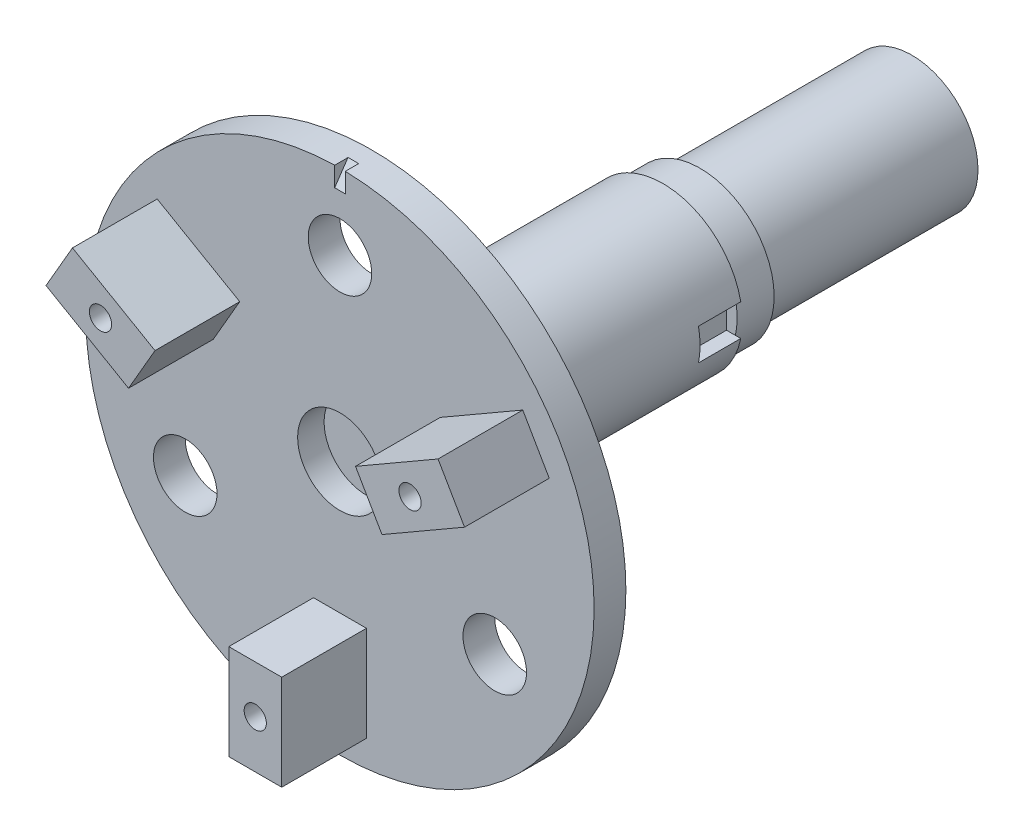
ISO-10303-21;
HEADER;
FILE_DESCRIPTION(('STEP AP214'),'2;1');
FILE_NAME('part.step','',(''),(''),'','','');
FILE_SCHEMA(('AUTOMOTIVE_DESIGN { 1 0 10303 214 1 1 1 1 }'));
ENDSEC;
DATA;
#1=APPLICATION_CONTEXT('core data for automotive mechanical design processes');
#2=APPLICATION_PROTOCOL_DEFINITION('international standard','automotive_design',2000,#1);
#3=PRODUCT_CONTEXT('',#1,'mechanical');
#4=PRODUCT('Part','Part','',(#3));
#5=PRODUCT_RELATED_PRODUCT_CATEGORY('part','',(#4));
#6=PRODUCT_DEFINITION_FORMATION('','',#4);
#7=PRODUCT_DEFINITION_CONTEXT('part definition',#1,'design');
#8=PRODUCT_DEFINITION('design','',#6,#7);
#9=PRODUCT_DEFINITION_SHAPE('','',#8);
#10=(LENGTH_UNIT() NAMED_UNIT(*) SI_UNIT(.MILLI.,.METRE.));
#11=(NAMED_UNIT(*) PLANE_ANGLE_UNIT() SI_UNIT($,.RADIAN.));
#12=(NAMED_UNIT(*) SI_UNIT($,.STERADIAN.) SOLID_ANGLE_UNIT());
#13=UNCERTAINTY_MEASURE_WITH_UNIT(LENGTH_MEASURE(1.E-05),#10,'distance_accuracy_value','');
#14=(GEOMETRIC_REPRESENTATION_CONTEXT(3) GLOBAL_UNCERTAINTY_ASSIGNED_CONTEXT((#13)) GLOBAL_UNIT_ASSIGNED_CONTEXT((#10,
#11,#12)) REPRESENTATION_CONTEXT('',''));
#15=CARTESIAN_POINT('',(0.,0.,0.));
#16=DIRECTION('',(0.,0.,1.));
#17=DIRECTION('',(1.,0.,0.));
#18=AXIS2_PLACEMENT_3D('',#15,#16,#17);
#19=CARTESIAN_POINT('',(0.,0.,4.));
#20=DIRECTION('',(0.,0.,1.));
#21=DIRECTION('',(1.,0.,0.));
#22=AXIS2_PLACEMENT_3D('',#19,#20,#21);
#23=CYLINDRICAL_SURFACE('',#22,15.);
#24=CARTESIAN_POINT('',(0.,0.,-6.));
#25=DIRECTION('',(0.,0.,1.));
#26=DIRECTION('',(1.,0.,0.));
#27=AXIS2_PLACEMENT_3D('',#24,#25,#26);
#28=CIRCLE('',#27,15.);
#29=CARTESIAN_POINT('',(15.,0.,-6.));
#30=VERTEX_POINT('',#29);
#31=EDGE_CURVE('E237',#30,#30,#28,.T.);
#32=ORIENTED_EDGE('',*,*,#31,.F.);
#33=EDGE_LOOP('',(#32));
#34=FACE_BOUND('',#33,.T.);
#35=DIRECTION('',(0.,0.,1.));
#36=VECTOR('',#35,1.);
#37=CARTESIAN_POINT('',(14.6969384566991,3.,4.));
#38=LINE('',#37,#36);
#39=CARTESIAN_POINT('',(14.6969384566991,3.,-58.));
#40=VERTEX_POINT('',#39);
#41=CARTESIAN_POINT('',(14.6969384566991,3.,-50.));
#42=VERTEX_POINT('',#41);
#43=EDGE_CURVE('E184',#40,#42,#38,.T.);
#44=ORIENTED_EDGE('',*,*,#43,.F.);
#45=CARTESIAN_POINT('',(0.,0.,-58.));
#46=DIRECTION('',(0.,0.,1.));
#47=DIRECTION('',(1.,0.,0.));
#48=AXIS2_PLACEMENT_3D('',#45,#46,#47);
#49=CIRCLE('',#48,15.);
#50=CARTESIAN_POINT('',(14.6969384566991,-3.,-58.));
#51=VERTEX_POINT('',#50);
#52=EDGE_CURVE('E232',#40,#51,#49,.T.);
#53=ORIENTED_EDGE('',*,*,#52,.T.);
#54=DIRECTION('',(0.,0.,1.));
#55=VECTOR('',#54,1.);
#56=CARTESIAN_POINT('',(14.6969384566991,-3.,4.));
#57=LINE('',#56,#55);
#58=CARTESIAN_POINT('',(14.6969384566991,-3.,-50.));
#59=VERTEX_POINT('',#58);
#60=EDGE_CURVE('E202',#51,#59,#57,.T.);
#61=ORIENTED_EDGE('',*,*,#60,.T.);
#62=CARTESIAN_POINT('',(0.,0.,-50.));
#63=DIRECTION('',(0.,0.,-1.));
#64=DIRECTION('',(-1.,0.,0.));
#65=AXIS2_PLACEMENT_3D('',#62,#63,#64);
#66=CIRCLE('',#65,15.);
#67=EDGE_CURVE('E11',#42,#59,#66,.T.);
#68=ORIENTED_EDGE('',*,*,#67,.F.);
#69=EDGE_LOOP('',(#44,#53,#61,#68));
#70=FACE_BOUND('',#69,.T.);
#71=ADVANCED_FACE('F41',(#34,#70),#23,.T.);
#72=CARTESIAN_POINT('',(0.,15.,-58.));
#73=DIRECTION('',(0.,0.,1.));
#74=DIRECTION('',(1.,0.,0.));
#75=AXIS2_PLACEMENT_3D('',#72,#73,#74);
#76=PLANE('',#75);
#77=DIRECTION('',(-1.,0.,0.));
#78=VECTOR('',#77,1.);
#79=CARTESIAN_POINT('',(12.,-3.,-58.));
#80=LINE('',#79,#78);
#81=CARTESIAN_POINT('',(13.6747943311773,-3.,-58.));
#82=VERTEX_POINT('',#81);
#83=EDGE_CURVE('E203',#51,#82,#80,.T.);
#84=ORIENTED_EDGE('',*,*,#83,.F.);
#85=ORIENTED_EDGE('',*,*,#52,.F.);
#86=DIRECTION('',(-1.,0.,0.));
#87=VECTOR('',#86,1.);
#88=CARTESIAN_POINT('',(12.,3.,-58.));
#89=LINE('',#88,#87);
#90=CARTESIAN_POINT('',(13.6747943311773,3.,-58.));
#91=VERTEX_POINT('',#90);
#92=EDGE_CURVE('E215',#40,#91,#89,.T.);
#93=ORIENTED_EDGE('',*,*,#92,.T.);
#94=CARTESIAN_POINT('',(0.,0.,-58.));
#95=DIRECTION('',(0.,0.,1.));
#96=DIRECTION('',(1.,0.,0.));
#97=AXIS2_PLACEMENT_3D('',#94,#95,#96);
#98=CIRCLE('',#97,14.);
#99=EDGE_CURVE('E233',#91,#82,#98,.T.);
#100=ORIENTED_EDGE('',*,*,#99,.T.);
#101=EDGE_LOOP('',(#84,#85,#93,#100));
#102=FACE_BOUND('',#101,.T.);
#103=ADVANCED_FACE('F423',(#102),#76,.F.);
#104=CARTESIAN_POINT('',(0.,0.,3.));
#105=DIRECTION('',(0.,0.,-1.));
#106=DIRECTION('',(-1.,0.,0.));
#107=AXIS2_PLACEMENT_3D('',#104,#105,#106);
#108=CYLINDRICAL_SURFACE('',#107,8.);
#109=CARTESIAN_POINT('',(0.,0.,3.));
#110=DIRECTION('',(0.,0.,1.));
#111=DIRECTION('',(1.,0.,0.));
#112=AXIS2_PLACEMENT_3D('',#109,#110,#111);
#113=CIRCLE('',#112,8.);
#114=CARTESIAN_POINT('',(8.,0.,3.));
#115=VERTEX_POINT('',#114);
#116=EDGE_CURVE('E394',#115,#115,#113,.T.);
#117=ORIENTED_EDGE('',*,*,#116,.T.);
#118=EDGE_LOOP('',(#117));
#119=FACE_BOUND('',#118,.T.);
#120=CARTESIAN_POINT('',(0.,0.,-2.));
#121=DIRECTION('',(0.,0.,-1.));
#122=DIRECTION('',(-1.,0.,0.));
#123=AXIS2_PLACEMENT_3D('',#120,#121,#122);
#124=CIRCLE('',#123,8.);
#125=CARTESIAN_POINT('',(-8.,0.,-2.));
#126=VERTEX_POINT('',#125);
#127=EDGE_CURVE('E250',#126,#126,#124,.T.);
#128=ORIENTED_EDGE('',*,*,#127,.T.);
#129=EDGE_LOOP('',(#128));
#130=FACE_BOUND('',#129,.T.);
#131=ADVANCED_FACE('F420',(#119,#130),#108,.F.);
#132=CARTESIAN_POINT('',(0.,0.,3.));
#133=DIRECTION('',(0.,0.,1.));
#134=DIRECTION('',(1.,0.,0.));
#135=AXIS2_PLACEMENT_3D('',#132,#133,#134);
#136=PLANE('',#135);
#137=CARTESIAN_POINT('',(-29.2283573777247,-16.8750000000001,3.));
#138=DIRECTION('',(0.,0.,1.));
#139=DIRECTION('',(1.,0.,0.));
#140=AXIS2_PLACEMENT_3D('',#137,#138,#139);
#141=CIRCLE('',#140,6.);
#142=CARTESIAN_POINT('',(-23.2283573777247,-16.8750000000001,3.));
#143=VERTEX_POINT('',#142);
#144=EDGE_CURVE('E383',#143,#143,#141,.T.);
#145=ORIENTED_EDGE('',*,*,#144,.F.);
#146=EDGE_LOOP('',(#145));
#147=FACE_BOUND('',#146,.T.);
#148=CARTESIAN_POINT('',(29.228357377725,-16.8749999999997,3.));
#149=DIRECTION('',(0.,0.,1.));
#150=DIRECTION('',(1.,0.,0.));
#151=AXIS2_PLACEMENT_3D('',#148,#149,#150);
#152=CIRCLE('',#151,6.);
#153=CARTESIAN_POINT('',(35.228357377725,-16.8749999999997,3.));
#154=VERTEX_POINT('',#153);
#155=EDGE_CURVE('E377',#154,#154,#152,.T.);
#156=ORIENTED_EDGE('',*,*,#155,.F.);
#157=EDGE_LOOP('',(#156));
#158=FACE_BOUND('',#157,.T.);
#159=CARTESIAN_POINT('',(0.,33.75,3.00001200000001));
#160=DIRECTION('',(0.,0.,1.));
#161=DIRECTION('',(1.,0.,0.));
#162=AXIS2_PLACEMENT_3D('',#159,#160,#161);
#163=CIRCLE('',#162,6.);
#164=CARTESIAN_POINT('',(6.,33.75,3.00001200000001));
#165=VERTEX_POINT('',#164);
#166=EDGE_CURVE('E389',#165,#165,#163,.T.);
#167=ORIENTED_EDGE('',*,*,#166,.F.);
#168=EDGE_LOOP('',(#167));
#169=FACE_BOUND('',#168,.T.);
#170=ORIENTED_EDGE('',*,*,#116,.F.);
#171=EDGE_LOOP('',(#170));
#172=FACE_BOUND('',#171,.T.);
#173=CARTESIAN_POINT('',(0.,0.,3.));
#174=DIRECTION('',(0.,0.,1.));
#175=DIRECTION('',(1.,0.,0.));
#176=AXIS2_PLACEMENT_3D('',#173,#174,#175);
#177=CIRCLE('',#176,48.);
#178=CARTESIAN_POINT('',(-1.,47.9895822028073,3.));
#179=VERTEX_POINT('',#178);
#180=CARTESIAN_POINT('',(0.999999999999994,47.9895822028073,3.));
#181=VERTEX_POINT('',#180);
#182=EDGE_CURVE('E442',#179,#181,#177,.T.);
#183=ORIENTED_EDGE('',*,*,#182,.T.);
#184=DIRECTION('',(0.,-1.,0.));
#185=VECTOR('',#184,1.);
#186=CARTESIAN_POINT('',(0.999999999999997,44.3000143886515,3.));
#187=LINE('',#186,#185);
#188=CARTESIAN_POINT('',(0.999999999999997,44.3000143886515,3.));
#189=VERTEX_POINT('',#188);
#190=EDGE_CURVE('E352',#181,#189,#187,.T.);
#191=ORIENTED_EDGE('',*,*,#190,.T.);
#192=DIRECTION('',(1.,0.,0.));
#193=VECTOR('',#192,1.);
#194=CARTESIAN_POINT('',(-0.999999999999994,44.3000143886515,3.));
#195=LINE('',#194,#193);
#196=CARTESIAN_POINT('',(-0.999999999999994,44.3000143886515,3.));
#197=VERTEX_POINT('',#196);
#198=EDGE_CURVE('E364',#197,#189,#195,.T.);
#199=ORIENTED_EDGE('',*,*,#198,.F.);
#200=DIRECTION('',(0.,-1.,0.));
#201=VECTOR('',#200,1.);
#202=CARTESIAN_POINT('',(-0.999999999999994,44.3000143886515,3.));
#203=LINE('',#202,#201);
#204=EDGE_CURVE('E358',#179,#197,#203,.T.);
#205=ORIENTED_EDGE('',*,*,#204,.F.);
#206=EDGE_LOOP('',(#183,#191,#199,#205));
#207=FACE_BOUND('',#206,.T.);
#208=DIRECTION('',(-1.,0.,0.));
#209=VECTOR('',#208,1.);
#210=CARTESIAN_POINT('',(0.,-42.75,3.));
#211=LINE('',#210,#209);
#212=CARTESIAN_POINT('',(5.,-42.75,3.));
#213=VERTEX_POINT('',#212);
#214=CARTESIAN_POINT('',(-5.,-42.75,3.));
#215=VERTEX_POINT('',#214);
#216=EDGE_CURVE('E456',#213,#215,#211,.T.);
#217=ORIENTED_EDGE('',*,*,#216,.T.);
#218=DIRECTION('',(0.,1.,0.));
#219=VECTOR('',#218,1.);
#220=CARTESIAN_POINT('',(-5.,0.,3.));
#221=LINE('',#220,#219);
#222=CARTESIAN_POINT('',(-5.,-24.75,3.));
#223=VERTEX_POINT('',#222);
#224=EDGE_CURVE('E465',#215,#223,#221,.T.);
#225=ORIENTED_EDGE('',*,*,#224,.T.);
#226=DIRECTION('',(1.,0.,0.));
#227=VECTOR('',#226,1.);
#228=CARTESIAN_POINT('',(0.,-24.75,3.));
#229=LINE('',#228,#227);
#230=CARTESIAN_POINT('',(5.,-24.75,3.));
#231=VERTEX_POINT('',#230);
#232=EDGE_CURVE('E448',#223,#231,#229,.T.);
#233=ORIENTED_EDGE('',*,*,#232,.T.);
#234=DIRECTION('',(0.,-1.,0.));
#235=VECTOR('',#234,1.);
#236=CARTESIAN_POINT('',(5.,0.,3.));
#237=LINE('',#236,#235);
#238=EDGE_CURVE('E454',#231,#213,#237,.T.);
#239=ORIENTED_EDGE('',*,*,#238,.T.);
#240=EDGE_LOOP('',(#217,#225,#233,#239));
#241=FACE_BOUND('',#240,.T.);
#242=DIRECTION('',(0.500000000000001,0.866025403784439,0.));
#243=VECTOR('',#242,1.);
#244=CARTESIAN_POINT('',(-37.0225860117848,21.375,3.));
#245=LINE('',#244,#243);
#246=CARTESIAN_POINT('',(-39.5225860117848,17.0448729810778,3.));
#247=VERTEX_POINT('',#246);
#248=CARTESIAN_POINT('',(-34.5225860117848,25.7051270189222,3.));
#249=VERTEX_POINT('',#248);
#250=EDGE_CURVE('E474',#247,#249,#245,.T.);
#251=ORIENTED_EDGE('',*,*,#250,.T.);
#252=DIRECTION('',(0.866025403784439,-0.500000000000001,0.));
#253=VECTOR('',#252,1.);
#254=CARTESIAN_POINT('',(2.5,4.33012701892219,3.));
#255=LINE('',#254,#253);
#256=CARTESIAN_POINT('',(-18.9341287436649,16.7051270189222,3.));
#257=VERTEX_POINT('',#256);
#258=EDGE_CURVE('E476',#249,#257,#255,.T.);
#259=ORIENTED_EDGE('',*,*,#258,.T.);
#260=DIRECTION('',(-0.500000000000001,-0.866025403784439,0.));
#261=VECTOR('',#260,1.);
#262=CARTESIAN_POINT('',(-21.4341287436649,12.375,3.));
#263=LINE('',#262,#261);
#264=CARTESIAN_POINT('',(-23.9341287436649,8.04487298107782,3.));
#265=VERTEX_POINT('',#264);
#266=EDGE_CURVE('E467',#257,#265,#263,.T.);
#267=ORIENTED_EDGE('',*,*,#266,.T.);
#268=DIRECTION('',(-0.866025403784439,0.500000000000001,0.));
#269=VECTOR('',#268,1.);
#270=CARTESIAN_POINT('',(-2.5,-4.33012701892219,3.));
#271=LINE('',#270,#269);
#272=EDGE_CURVE('E468',#265,#247,#271,.T.);
#273=ORIENTED_EDGE('',*,*,#272,.T.);
#274=EDGE_LOOP('',(#251,#259,#267,#273));
#275=FACE_BOUND('',#274,.T.);
#276=DIRECTION('',(0.5,-0.866025403784439,0.));
#277=VECTOR('',#276,1.);
#278=CARTESIAN_POINT('',(37.0225860117848,21.375,3.));
#279=LINE('',#278,#277);
#280=CARTESIAN_POINT('',(34.5225860117848,25.7051270189222,3.));
#281=VERTEX_POINT('',#280);
#282=CARTESIAN_POINT('',(39.5225860117848,17.0448729810778,3.));
#283=VERTEX_POINT('',#282);
#284=EDGE_CURVE('E489',#281,#283,#279,.T.);
#285=ORIENTED_EDGE('',*,*,#284,.T.);
#286=DIRECTION('',(-0.866025403784439,-0.5,0.));
#287=VECTOR('',#286,1.);
#288=CARTESIAN_POINT('',(2.5,-4.33012701892219,3.));
#289=LINE('',#288,#287);
#290=CARTESIAN_POINT('',(23.9341287436649,8.04487298107781,3.));
#291=VERTEX_POINT('',#290);
#292=EDGE_CURVE('E494',#283,#291,#289,.T.);
#293=ORIENTED_EDGE('',*,*,#292,.T.);
#294=DIRECTION('',(-0.5,0.866025403784439,0.));
#295=VECTOR('',#294,1.);
#296=CARTESIAN_POINT('',(21.4341287436649,12.375,3.));
#297=LINE('',#296,#295);
#298=CARTESIAN_POINT('',(18.9341287436649,16.7051270189222,3.));
#299=VERTEX_POINT('',#298);
#300=EDGE_CURVE('E485',#291,#299,#297,.T.);
#301=ORIENTED_EDGE('',*,*,#300,.T.);
#302=DIRECTION('',(0.866025403784439,0.5,0.));
#303=VECTOR('',#302,1.);
#304=CARTESIAN_POINT('',(-2.5,4.33012701892219,3.));
#305=LINE('',#304,#303);
#306=EDGE_CURVE('E488',#299,#281,#305,.T.);
#307=ORIENTED_EDGE('',*,*,#306,.T.);
#308=EDGE_LOOP('',(#285,#293,#301,#307));
#309=FACE_BOUND('',#308,.T.);
#310=ADVANCED_FACE('F417',(#147,#158,#169,#172,#207,#241,#275,#309),#136,.T.);
#311=CARTESIAN_POINT('',(0.,0.,-3.));
#312=DIRECTION('',(0.,0.,1.));
#313=DIRECTION('',(1.,0.,0.));
#314=AXIS2_PLACEMENT_3D('',#311,#312,#313);
#315=PLANE('',#314);
#316=CARTESIAN_POINT('',(0.,0.,-3.));
#317=DIRECTION('',(0.,0.,1.));
#318=DIRECTION('',(1.,0.,0.));
#319=AXIS2_PLACEMENT_3D('',#316,#317,#318);
#320=CIRCLE('',#319,18.);
#321=CARTESIAN_POINT('',(18.,0.,-3.));
#322=VERTEX_POINT('',#321);
#323=EDGE_CURVE('E49',#322,#322,#320,.F.);
#324=ORIENTED_EDGE('',*,*,#323,.F.);
#325=EDGE_LOOP('',(#324));
#326=FACE_BOUND('',#325,.T.);
#327=CARTESIAN_POINT('',(-29.2283573777247,-16.8750000000001,-3.));
#328=DIRECTION('',(0.,0.,1.));
#329=DIRECTION('',(-0.500000000000004,0.866025403784437,0.));
#330=AXIS2_PLACEMENT_3D('',#327,#328,#329);
#331=CIRCLE('',#330,6.);
#332=CARTESIAN_POINT('',(-32.2283573777248,-11.6788475772935,-3.));
#333=VERTEX_POINT('',#332);
#334=EDGE_CURVE('E372',#333,#333,#331,.T.);
#335=ORIENTED_EDGE('',*,*,#334,.T.);
#336=EDGE_LOOP('',(#335));
#337=FACE_BOUND('',#336,.T.);
#338=CARTESIAN_POINT('',(29.228357377725,-16.8749999999997,-3.));
#339=DIRECTION('',(0.,0.,1.));
#340=DIRECTION('',(-0.499999999999992,-0.866025403784443,0.));
#341=AXIS2_PLACEMENT_3D('',#338,#339,#340);
#342=CIRCLE('',#341,6.);
#343=CARTESIAN_POINT('',(26.228357377725,-22.0711524227064,-3.));
#344=VERTEX_POINT('',#343);
#345=EDGE_CURVE('E373',#344,#344,#342,.T.);
#346=ORIENTED_EDGE('',*,*,#345,.T.);
#347=EDGE_LOOP('',(#346));
#348=FACE_BOUND('',#347,.T.);
#349=CARTESIAN_POINT('',(0.,33.75,-3.));
#350=DIRECTION('',(0.,0.,1.));
#351=DIRECTION('',(1.,0.,0.));
#352=AXIS2_PLACEMENT_3D('',#349,#350,#351);
#353=CIRCLE('',#352,6.);
#354=CARTESIAN_POINT('',(6.,33.75,-3.));
#355=VERTEX_POINT('',#354);
#356=EDGE_CURVE('E387',#355,#355,#353,.T.);
#357=ORIENTED_EDGE('',*,*,#356,.T.);
#358=EDGE_LOOP('',(#357));
#359=FACE_BOUND('',#358,.T.);
#360=CARTESIAN_POINT('',(0.,0.,-3.));
#361=DIRECTION('',(0.,0.,1.));
#362=DIRECTION('',(1.,0.,0.));
#363=AXIS2_PLACEMENT_3D('',#360,#361,#362);
#364=CIRCLE('',#363,48.);
#365=CARTESIAN_POINT('',(48.,0.,-3.));
#366=VERTEX_POINT('',#365);
#367=EDGE_CURVE('E520',#366,#366,#364,.T.);
#368=ORIENTED_EDGE('',*,*,#367,.F.);
#369=EDGE_LOOP('',(#368));
#370=FACE_BOUND('',#369,.T.);
#371=ADVANCED_FACE('F424',(#326,#337,#348,#359,#370),#315,.F.);
#372=CARTESIAN_POINT('',(0.,0.,3.));
#373=DIRECTION('',(0.,0.,-1.));
#374=DIRECTION('',(-1.,0.,0.));
#375=AXIS2_PLACEMENT_3D('',#372,#373,#374);
#376=CYLINDRICAL_SURFACE('',#375,48.);
#377=DIRECTION('',(0.,0.,-1.));
#378=VECTOR('',#377,1.);
#379=CARTESIAN_POINT('',(-1.,47.9895822028073,3.));
#380=LINE('',#379,#378);
#381=CARTESIAN_POINT('',(-1.,47.9895822028073,0.484020886613562));
#382=VERTEX_POINT('',#381);
#383=EDGE_CURVE('E450',#382,#179,#380,.F.);
#384=ORIENTED_EDGE('',*,*,#383,.F.);
#385=CARTESIAN_POINT('',(0.,0.,33.2089340916659));
#386=DIRECTION('',(0.,-0.563392571783441,-0.8261893306375));
#387=DIRECTION('',(0.,0.8261893306375,-0.563392571783441));
#388=AXIS2_PLACEMENT_3D('',#385,#386,#387);
#389=ELLIPSE('',#388,58.0980632647029,48.);
#390=CARTESIAN_POINT('',(0.999999999999993,47.9895822028073,0.484020886613562));
#391=VERTEX_POINT('',#390);
#392=EDGE_CURVE('E445',#382,#391,#389,.T.);
#393=ORIENTED_EDGE('',*,*,#392,.T.);
#394=DIRECTION('',(0.,0.,-1.));
#395=VECTOR('',#394,1.);
#396=CARTESIAN_POINT('',(0.999999999999994,47.9895822028073,3.));
#397=LINE('',#396,#395);
#398=EDGE_CURVE('E433',#391,#181,#397,.F.);
#399=ORIENTED_EDGE('',*,*,#398,.T.);
#400=ORIENTED_EDGE('',*,*,#182,.F.);
#401=EDGE_LOOP('',(#384,#393,#399,#400));
#402=FACE_BOUND('',#401,.T.);
#403=ORIENTED_EDGE('',*,*,#367,.T.);
#404=EDGE_LOOP('',(#403));
#405=FACE_BOUND('',#404,.T.);
#406=ADVANCED_FACE('F43',(#402,#405),#376,.T.);
#407=CARTESIAN_POINT('',(0.,33.75,-3.));
#408=DIRECTION('',(0.,0.,1.));
#409=DIRECTION('',(1.,0.,0.));
#410=AXIS2_PLACEMENT_3D('',#407,#408,#409);
#411=CYLINDRICAL_SURFACE('',#410,6.);
#412=ORIENTED_EDGE('',*,*,#356,.F.);
#413=EDGE_LOOP('',(#412));
#414=FACE_BOUND('',#413,.T.);
#415=ORIENTED_EDGE('',*,*,#166,.T.);
#416=EDGE_LOOP('',(#415));
#417=FACE_BOUND('',#416,.T.);
#418=ADVANCED_FACE('F404',(#414,#417),#411,.F.);
#419=CARTESIAN_POINT('',(29.228357377725,-16.8749999999997,-3.));
#420=DIRECTION('',(0.,0.,1.));
#421=DIRECTION('',(1.,0.,0.));
#422=AXIS2_PLACEMENT_3D('',#419,#420,#421);
#423=CYLINDRICAL_SURFACE('',#422,6.);
#424=ORIENTED_EDGE('',*,*,#155,.T.);
#425=EDGE_LOOP('',(#424));
#426=FACE_BOUND('',#425,.T.);
#427=ORIENTED_EDGE('',*,*,#345,.F.);
#428=EDGE_LOOP('',(#427));
#429=FACE_BOUND('',#428,.T.);
#430=ADVANCED_FACE('F414',(#426,#429),#423,.F.);
#431=CARTESIAN_POINT('',(-29.2283573777247,-16.8750000000001,-3.));
#432=DIRECTION('',(0.,0.,1.));
#433=DIRECTION('',(1.,0.,0.));
#434=AXIS2_PLACEMENT_3D('',#431,#432,#433);
#435=CYLINDRICAL_SURFACE('',#434,6.);
#436=ORIENTED_EDGE('',*,*,#144,.T.);
#437=EDGE_LOOP('',(#436));
#438=FACE_BOUND('',#437,.T.);
#439=ORIENTED_EDGE('',*,*,#334,.F.);
#440=EDGE_LOOP('',(#439));
#441=FACE_BOUND('',#440,.T.);
#442=ADVANCED_FACE('F680',(#438,#441),#435,.F.);
#443=CARTESIAN_POINT('',(-1.,48.,0.476916813327871));
#444=DIRECTION('',(0.,-0.563392571783441,-0.8261893306375));
#445=DIRECTION('',(0.,0.8261893306375,-0.563392571783441));
#446=AXIS2_PLACEMENT_3D('',#443,#444,#445);
#447=PLANE('',#446);
#448=ORIENTED_EDGE('',*,*,#392,.F.);
#449=DIRECTION('',(0.,0.8261893306375,-0.563392571783441));
#450=VECTOR('',#449,1.);
#451=CARTESIAN_POINT('',(-1.,48.,0.476916813327871));
#452=LINE('',#451,#450);
#453=EDGE_CURVE('E360',#197,#382,#452,.T.);
#454=ORIENTED_EDGE('',*,*,#453,.F.);
#455=ORIENTED_EDGE('',*,*,#198,.T.);
#456=DIRECTION('',(0.,0.8261893306375,-0.563392571783441));
#457=VECTOR('',#456,1.);
#458=CARTESIAN_POINT('',(0.999999999999997,48.,0.476916813327871));
#459=LINE('',#458,#457);
#460=EDGE_CURVE('E359',#189,#391,#459,.T.);
#461=ORIENTED_EDGE('',*,*,#460,.T.);
#462=EDGE_LOOP('',(#448,#454,#455,#461));
#463=FACE_BOUND('',#462,.T.);
#464=ADVANCED_FACE('F673',(#463),#447,.F.);
#465=CARTESIAN_POINT('',(-1.,0.,0.));
#466=DIRECTION('',(1.,0.,0.));
#467=DIRECTION('',(0.,0.,-1.));
#468=AXIS2_PLACEMENT_3D('',#465,#466,#467);
#469=PLANE('',#468);
#470=ORIENTED_EDGE('',*,*,#383,.T.);
#471=ORIENTED_EDGE('',*,*,#204,.T.);
#472=ORIENTED_EDGE('',*,*,#453,.T.);
#473=EDGE_LOOP('',(#470,#471,#472));
#474=FACE_BOUND('',#473,.T.);
#475=ADVANCED_FACE('F666',(#474),#469,.T.);
#476=CARTESIAN_POINT('',(1.,0.,0.));
#477=DIRECTION('',(1.,0.,0.));
#478=DIRECTION('',(0.,0.,-1.));
#479=AXIS2_PLACEMENT_3D('',#476,#477,#478);
#480=PLANE('',#479);
#481=ORIENTED_EDGE('',*,*,#460,.F.);
#482=ORIENTED_EDGE('',*,*,#190,.F.);
#483=ORIENTED_EDGE('',*,*,#398,.F.);
#484=EDGE_LOOP('',(#481,#482,#483));
#485=FACE_BOUND('',#484,.T.);
#486=ADVANCED_FACE('F668',(#485),#480,.F.);
#487=CARTESIAN_POINT('',(-5.,-42.75,19.));
#488=DIRECTION('',(1.,0.,0.));
#489=DIRECTION('',(0.,0.,-1.));
#490=AXIS2_PLACEMENT_3D('',#487,#488,#489);
#491=PLANE('',#490);
#492=ORIENTED_EDGE('',*,*,#224,.F.);
#493=DIRECTION('',(0.,0.,-1.));
#494=VECTOR('',#493,1.);
#495=CARTESIAN_POINT('',(-5.,-42.75,19.));
#496=LINE('',#495,#494);
#497=CARTESIAN_POINT('',(-5.,-42.75,19.));
#498=VERTEX_POINT('',#497);
#499=EDGE_CURVE('E353',#498,#215,#496,.T.);
#500=ORIENTED_EDGE('',*,*,#499,.F.);
#501=DIRECTION('',(0.,-1.,0.));
#502=VECTOR('',#501,1.);
#503=CARTESIAN_POINT('',(-5.,-42.75,19.));
#504=LINE('',#503,#502);
#505=CARTESIAN_POINT('',(-5.,-24.75,19.));
#506=VERTEX_POINT('',#505);
#507=EDGE_CURVE('E324',#506,#498,#504,.T.);
#508=ORIENTED_EDGE('',*,*,#507,.F.);
#509=DIRECTION('',(0.,0.,-1.));
#510=VECTOR('',#509,1.);
#511=CARTESIAN_POINT('',(-5.,-24.75,19.));
#512=LINE('',#511,#510);
#513=EDGE_CURVE('E338',#506,#223,#512,.T.);
#514=ORIENTED_EDGE('',*,*,#513,.T.);
#515=EDGE_LOOP('',(#492,#500,#508,#514));
#516=FACE_BOUND('',#515,.T.);
#517=ADVANCED_FACE('F665',(#516),#491,.F.);
#518=CARTESIAN_POINT('',(5.,-42.75,19.));
#519=DIRECTION('',(0.,1.,0.));
#520=DIRECTION('',(0.,0.,1.));
#521=AXIS2_PLACEMENT_3D('',#518,#519,#520);
#522=PLANE('',#521);
#523=ORIENTED_EDGE('',*,*,#216,.F.);
#524=DIRECTION('',(0.,0.,-1.));
#525=VECTOR('',#524,1.);
#526=CARTESIAN_POINT('',(5.,-42.75,19.));
#527=LINE('',#526,#525);
#528=CARTESIAN_POINT('',(5.,-42.75,19.));
#529=VERTEX_POINT('',#528);
#530=EDGE_CURVE('E350',#529,#213,#527,.T.);
#531=ORIENTED_EDGE('',*,*,#530,.F.);
#532=DIRECTION('',(1.,0.,0.));
#533=VECTOR('',#532,1.);
#534=CARTESIAN_POINT('',(5.,-42.75,19.));
#535=LINE('',#534,#533);
#536=EDGE_CURVE('E333',#498,#529,#535,.T.);
#537=ORIENTED_EDGE('',*,*,#536,.F.);
#538=ORIENTED_EDGE('',*,*,#499,.T.);
#539=EDGE_LOOP('',(#523,#531,#537,#538));
#540=FACE_BOUND('',#539,.T.);
#541=ADVANCED_FACE('F656',(#540),#522,.F.);
#542=CARTESIAN_POINT('',(5.,-24.75,19.));
#543=DIRECTION('',(-1.,0.,0.));
#544=DIRECTION('',(0.,0.,1.));
#545=AXIS2_PLACEMENT_3D('',#542,#543,#544);
#546=PLANE('',#545);
#547=ORIENTED_EDGE('',*,*,#238,.F.);
#548=DIRECTION('',(0.,0.,-1.));
#549=VECTOR('',#548,1.);
#550=CARTESIAN_POINT('',(5.,-24.75,19.));
#551=LINE('',#550,#549);
#552=CARTESIAN_POINT('',(5.,-24.75,19.));
#553=VERTEX_POINT('',#552);
#554=EDGE_CURVE('E344',#553,#231,#551,.T.);
#555=ORIENTED_EDGE('',*,*,#554,.F.);
#556=DIRECTION('',(0.,1.,0.));
#557=VECTOR('',#556,1.);
#558=CARTESIAN_POINT('',(5.,-24.75,19.));
#559=LINE('',#558,#557);
#560=EDGE_CURVE('E334',#529,#553,#559,.T.);
#561=ORIENTED_EDGE('',*,*,#560,.F.);
#562=ORIENTED_EDGE('',*,*,#530,.T.);
#563=EDGE_LOOP('',(#547,#555,#561,#562));
#564=FACE_BOUND('',#563,.T.);
#565=ADVANCED_FACE('F654',(#564),#546,.F.);
#566=CARTESIAN_POINT('',(-5.,-24.75,19.));
#567=DIRECTION('',(0.,-1.,0.));
#568=DIRECTION('',(0.,0.,-1.));
#569=AXIS2_PLACEMENT_3D('',#566,#567,#568);
#570=PLANE('',#569);
#571=ORIENTED_EDGE('',*,*,#232,.F.);
#572=ORIENTED_EDGE('',*,*,#513,.F.);
#573=DIRECTION('',(-1.,0.,0.));
#574=VECTOR('',#573,1.);
#575=CARTESIAN_POINT('',(-5.,-24.75,19.));
#576=LINE('',#575,#574);
#577=EDGE_CURVE('E340',#553,#506,#576,.T.);
#578=ORIENTED_EDGE('',*,*,#577,.F.);
#579=ORIENTED_EDGE('',*,*,#554,.T.);
#580=EDGE_LOOP('',(#571,#572,#578,#579));
#581=FACE_BOUND('',#580,.T.);
#582=ADVANCED_FACE('F647',(#581),#570,.F.);
#583=CARTESIAN_POINT('',(0.,0.,19.));
#584=DIRECTION('',(0.,0.,-1.));
#585=DIRECTION('',(-1.,0.,0.));
#586=AXIS2_PLACEMENT_3D('',#583,#584,#585);
#587=PLANE('',#586);
#588=CARTESIAN_POINT('',(0.,-33.75,19.));
#589=DIRECTION('',(0.,0.,1.));
#590=DIRECTION('',(1.,0.,0.));
#591=AXIS2_PLACEMENT_3D('',#588,#589,#590);
#592=CIRCLE('',#591,2.1);
#593=CARTESIAN_POINT('',(2.1,-33.75,19.));
#594=VERTEX_POINT('',#593);
#595=EDGE_CURVE('E291',#594,#594,#592,.T.);
#596=ORIENTED_EDGE('',*,*,#595,.F.);
#597=EDGE_LOOP('',(#596));
#598=FACE_BOUND('',#597,.T.);
#599=ORIENTED_EDGE('',*,*,#507,.T.);
#600=ORIENTED_EDGE('',*,*,#536,.T.);
#601=ORIENTED_EDGE('',*,*,#560,.T.);
#602=ORIENTED_EDGE('',*,*,#577,.T.);
#603=EDGE_LOOP('',(#599,#600,#601,#602));
#604=FACE_BOUND('',#603,.T.);
#605=ADVANCED_FACE('F648',(#598,#604),#587,.F.);
#606=CARTESIAN_POINT('',(0.,-33.75,7.));
#607=DIRECTION('',(0.,0.,1.));
#608=DIRECTION('',(1.,0.,0.));
#609=AXIS2_PLACEMENT_3D('',#606,#607,#608);
#610=CYLINDRICAL_SURFACE('',#609,2.1);
#611=CARTESIAN_POINT('',(0.,-33.75,7.));
#612=DIRECTION('',(0.,0.,1.));
#613=DIRECTION('',(1.,0.,0.));
#614=AXIS2_PLACEMENT_3D('',#611,#612,#613);
#615=CIRCLE('',#614,2.1);
#616=CARTESIAN_POINT('',(2.1,-33.75,7.));
#617=VERTEX_POINT('',#616);
#618=EDGE_CURVE('E318',#617,#617,#615,.T.);
#619=ORIENTED_EDGE('',*,*,#618,.F.);
#620=EDGE_LOOP('',(#619));
#621=FACE_BOUND('',#620,.T.);
#622=ORIENTED_EDGE('',*,*,#595,.T.);
#623=EDGE_LOOP('',(#622));
#624=FACE_BOUND('',#623,.T.);
#625=ADVANCED_FACE('F645',(#621,#624),#610,.F.);
#626=CARTESIAN_POINT('',(0.,-33.75,7.));
#627=DIRECTION('',(0.,0.,1.));
#628=DIRECTION('',(1.,0.,0.));
#629=AXIS2_PLACEMENT_3D('',#626,#627,#628);
#630=PLANE('',#629);
#631=ORIENTED_EDGE('',*,*,#618,.T.);
#632=EDGE_LOOP('',(#631));
#633=FACE_BOUND('',#632,.T.);
#634=ADVANCED_FACE('F638',(#633),#630,.T.);
#635=CARTESIAN_POINT('',(-34.5225860117848,25.7051270189222,19.));
#636=DIRECTION('',(-0.500000000000001,-0.866025403784439,0.));
#637=DIRECTION('',(0.866025403784439,-0.500000000000001,0.));
#638=AXIS2_PLACEMENT_3D('',#635,#636,#637);
#639=PLANE('',#638);
#640=ORIENTED_EDGE('',*,*,#258,.F.);
#641=DIRECTION('',(0.,0.,-1.));
#642=VECTOR('',#641,1.);
#643=CARTESIAN_POINT('',(-34.5225860117848,25.7051270189222,19.));
#644=LINE('',#643,#642);
#645=CARTESIAN_POINT('',(-34.5225860117848,25.7051270189222,19.));
#646=VERTEX_POINT('',#645);
#647=EDGE_CURVE('E267',#646,#249,#644,.T.);
#648=ORIENTED_EDGE('',*,*,#647,.F.);
#649=DIRECTION('',(-0.866025403784439,0.500000000000001,0.));
#650=VECTOR('',#649,1.);
#651=CARTESIAN_POINT('',(-34.5225860117848,25.7051270189222,19.));
#652=LINE('',#651,#650);
#653=CARTESIAN_POINT('',(-18.9341287436649,16.7051270189222,19.));
#654=VERTEX_POINT('',#653);
#655=EDGE_CURVE('E255',#654,#646,#652,.T.);
#656=ORIENTED_EDGE('',*,*,#655,.F.);
#657=DIRECTION('',(0.,0.,-1.));
#658=VECTOR('',#657,1.);
#659=CARTESIAN_POINT('',(-18.9341287436649,16.7051270189222,19.));
#660=LINE('',#659,#658);
#661=EDGE_CURVE('E306',#654,#257,#660,.T.);
#662=ORIENTED_EDGE('',*,*,#661,.T.);
#663=EDGE_LOOP('',(#640,#648,#656,#662));
#664=FACE_BOUND('',#663,.T.);
#665=ADVANCED_FACE('F617',(#664),#639,.F.);
#666=CARTESIAN_POINT('',(-39.5225860117848,17.0448729810778,19.));
#667=DIRECTION('',(0.866025403784439,-0.500000000000001,0.));
#668=DIRECTION('',(0.500000000000001,0.866025403784439,0.));
#669=AXIS2_PLACEMENT_3D('',#666,#667,#668);
#670=PLANE('',#669);
#671=ORIENTED_EDGE('',*,*,#250,.F.);
#672=DIRECTION('',(0.,0.,-1.));
#673=VECTOR('',#672,1.);
#674=CARTESIAN_POINT('',(-39.5225860117848,17.0448729810778,19.));
#675=LINE('',#674,#673);
#676=CARTESIAN_POINT('',(-39.5225860117848,17.0448729810778,19.));
#677=VERTEX_POINT('',#676);
#678=EDGE_CURVE('E312',#677,#247,#675,.T.);
#679=ORIENTED_EDGE('',*,*,#678,.F.);
#680=DIRECTION('',(-0.500000000000001,-0.866025403784439,0.));
#681=VECTOR('',#680,1.);
#682=CARTESIAN_POINT('',(-39.5225860117848,17.0448729810778,19.));
#683=LINE('',#682,#681);
#684=EDGE_CURVE('E300',#646,#677,#683,.T.);
#685=ORIENTED_EDGE('',*,*,#684,.F.);
#686=ORIENTED_EDGE('',*,*,#647,.T.);
#687=EDGE_LOOP('',(#671,#679,#685,#686));
#688=FACE_BOUND('',#687,.T.);
#689=ADVANCED_FACE('F620',(#688),#670,.F.);
#690=CARTESIAN_POINT('',(-23.9341287436649,8.04487298107782,19.));
#691=DIRECTION('',(0.500000000000001,0.866025403784439,0.));
#692=DIRECTION('',(-0.866025403784439,0.500000000000001,0.));
#693=AXIS2_PLACEMENT_3D('',#690,#691,#692);
#694=PLANE('',#693);
#695=ORIENTED_EDGE('',*,*,#272,.F.);
#696=DIRECTION('',(0.,0.,-1.));
#697=VECTOR('',#696,1.);
#698=CARTESIAN_POINT('',(-23.9341287436649,8.04487298107782,19.));
#699=LINE('',#698,#697);
#700=CARTESIAN_POINT('',(-23.9341287436649,8.04487298107782,19.));
#701=VERTEX_POINT('',#700);
#702=EDGE_CURVE('E309',#701,#265,#699,.T.);
#703=ORIENTED_EDGE('',*,*,#702,.F.);
#704=DIRECTION('',(0.866025403784439,-0.500000000000001,0.));
#705=VECTOR('',#704,1.);
#706=CARTESIAN_POINT('',(-23.9341287436649,8.04487298107782,19.));
#707=LINE('',#706,#705);
#708=EDGE_CURVE('E297',#677,#701,#707,.T.);
#709=ORIENTED_EDGE('',*,*,#708,.F.);
#710=ORIENTED_EDGE('',*,*,#678,.T.);
#711=EDGE_LOOP('',(#695,#703,#709,#710));
#712=FACE_BOUND('',#711,.T.);
#713=ADVANCED_FACE('F624',(#712),#694,.F.);
#714=CARTESIAN_POINT('',(-18.9341287436649,16.7051270189222,19.));
#715=DIRECTION('',(-0.866025403784439,0.500000000000001,0.));
#716=DIRECTION('',(-0.500000000000001,-0.866025403784439,0.));
#717=AXIS2_PLACEMENT_3D('',#714,#715,#716);
#718=PLANE('',#717);
#719=ORIENTED_EDGE('',*,*,#266,.F.);
#720=ORIENTED_EDGE('',*,*,#661,.F.);
#721=DIRECTION('',(0.500000000000001,0.866025403784439,0.));
#722=VECTOR('',#721,1.);
#723=CARTESIAN_POINT('',(-18.9341287436649,16.7051270189222,19.));
#724=LINE('',#723,#722);
#725=EDGE_CURVE('E303',#701,#654,#724,.T.);
#726=ORIENTED_EDGE('',*,*,#725,.F.);
#727=ORIENTED_EDGE('',*,*,#702,.T.);
#728=EDGE_LOOP('',(#719,#720,#726,#727));
#729=FACE_BOUND('',#728,.T.);
#730=ADVANCED_FACE('F609',(#729),#718,.F.);
#731=CARTESIAN_POINT('',(0.,0.,19.));
#732=DIRECTION('',(0.,0.,-1.));
#733=DIRECTION('',(0.500000000000001,0.866025403784439,0.));
#734=AXIS2_PLACEMENT_3D('',#731,#732,#733);
#735=PLANE('',#734);
#736=CARTESIAN_POINT('',(-29.2283573777248,16.875,19.));
#737=DIRECTION('',(0.,0.,1.));
#738=DIRECTION('',(-0.500000000000001,-0.866025403784439,0.));
#739=AXIS2_PLACEMENT_3D('',#736,#737,#738);
#740=CIRCLE('',#739,2.1);
#741=CARTESIAN_POINT('',(-30.2783573777248,15.0563466520527,19.));
#742=VERTEX_POINT('',#741);
#743=EDGE_CURVE('E263',#742,#742,#740,.T.);
#744=ORIENTED_EDGE('',*,*,#743,.F.);
#745=EDGE_LOOP('',(#744));
#746=FACE_BOUND('',#745,.T.);
#747=ORIENTED_EDGE('',*,*,#655,.T.);
#748=ORIENTED_EDGE('',*,*,#684,.T.);
#749=ORIENTED_EDGE('',*,*,#708,.T.);
#750=ORIENTED_EDGE('',*,*,#725,.T.);
#751=EDGE_LOOP('',(#747,#748,#749,#750));
#752=FACE_BOUND('',#751,.T.);
#753=ADVANCED_FACE('F608',(#746,#752),#735,.F.);
#754=CARTESIAN_POINT('',(39.5225860117848,17.0448729810778,19.));
#755=DIRECTION('',(-0.5,0.866025403784439,0.));
#756=DIRECTION('',(-0.866025403784439,-0.5,0.));
#757=AXIS2_PLACEMENT_3D('',#754,#755,#756);
#758=PLANE('',#757);
#759=ORIENTED_EDGE('',*,*,#292,.F.);
#760=DIRECTION('',(0.,0.,-1.));
#761=VECTOR('',#760,1.);
#762=CARTESIAN_POINT('',(39.5225860117848,17.0448729810778,19.));
#763=LINE('',#762,#761);
#764=CARTESIAN_POINT('',(39.5225860117848,17.0448729810778,19.));
#765=VERTEX_POINT('',#764);
#766=EDGE_CURVE('E289',#765,#283,#763,.T.);
#767=ORIENTED_EDGE('',*,*,#766,.F.);
#768=DIRECTION('',(0.866025403784439,0.5,0.));
#769=VECTOR('',#768,1.);
#770=CARTESIAN_POINT('',(39.5225860117848,17.0448729810778,19.));
#771=LINE('',#770,#769);
#772=CARTESIAN_POINT('',(23.9341287436649,8.04487298107781,19.));
#773=VERTEX_POINT('',#772);
#774=EDGE_CURVE('E262',#773,#765,#771,.T.);
#775=ORIENTED_EDGE('',*,*,#774,.F.);
#776=DIRECTION('',(0.,0.,-1.));
#777=VECTOR('',#776,1.);
#778=CARTESIAN_POINT('',(23.9341287436649,8.04487298107781,19.));
#779=LINE('',#778,#777);
#780=EDGE_CURVE('E279',#773,#291,#779,.T.);
#781=ORIENTED_EDGE('',*,*,#780,.T.);
#782=EDGE_LOOP('',(#759,#767,#775,#781));
#783=FACE_BOUND('',#782,.T.);
#784=ADVANCED_FACE('F550',(#783),#758,.F.);
#785=CARTESIAN_POINT('',(34.5225860117848,25.7051270189222,19.));
#786=DIRECTION('',(-0.866025403784439,-0.5,0.));
#787=DIRECTION('',(0.5,-0.866025403784439,0.));
#788=AXIS2_PLACEMENT_3D('',#785,#786,#787);
#789=PLANE('',#788);
#790=ORIENTED_EDGE('',*,*,#284,.F.);
#791=DIRECTION('',(0.,0.,-1.));
#792=VECTOR('',#791,1.);
#793=CARTESIAN_POINT('',(34.5225860117848,25.7051270189222,19.));
#794=LINE('',#793,#792);
#795=CARTESIAN_POINT('',(34.5225860117848,25.7051270189222,19.));
#796=VERTEX_POINT('',#795);
#797=EDGE_CURVE('E282',#796,#281,#794,.T.);
#798=ORIENTED_EDGE('',*,*,#797,.F.);
#799=DIRECTION('',(-0.5,0.866025403784439,0.));
#800=VECTOR('',#799,1.);
#801=CARTESIAN_POINT('',(34.5225860117848,25.7051270189222,19.));
#802=LINE('',#801,#800);
#803=EDGE_CURVE('E269',#765,#796,#802,.T.);
#804=ORIENTED_EDGE('',*,*,#803,.F.);
#805=ORIENTED_EDGE('',*,*,#766,.T.);
#806=EDGE_LOOP('',(#790,#798,#804,#805));
#807=FACE_BOUND('',#806,.T.);
#808=ADVANCED_FACE('F540',(#807),#789,.F.);
#809=CARTESIAN_POINT('',(18.9341287436649,16.7051270189222,19.));
#810=DIRECTION('',(0.5,-0.866025403784439,0.));
#811=DIRECTION('',(0.866025403784439,0.5,0.));
#812=AXIS2_PLACEMENT_3D('',#809,#810,#811);
#813=PLANE('',#812);
#814=ORIENTED_EDGE('',*,*,#306,.F.);
#815=DIRECTION('',(0.,0.,-1.));
#816=VECTOR('',#815,1.);
#817=CARTESIAN_POINT('',(18.9341287436649,16.7051270189222,19.));
#818=LINE('',#817,#816);
#819=CARTESIAN_POINT('',(18.9341287436649,16.7051270189222,19.));
#820=VERTEX_POINT('',#819);
#821=EDGE_CURVE('E64',#820,#299,#818,.T.);
#822=ORIENTED_EDGE('',*,*,#821,.F.);
#823=DIRECTION('',(-0.866025403784439,-0.5,0.));
#824=VECTOR('',#823,1.);
#825=CARTESIAN_POINT('',(18.9341287436649,16.7051270189222,19.));
#826=LINE('',#825,#824);
#827=EDGE_CURVE('E271',#796,#820,#826,.T.);
#828=ORIENTED_EDGE('',*,*,#827,.F.);
#829=ORIENTED_EDGE('',*,*,#797,.T.);
#830=EDGE_LOOP('',(#814,#822,#828,#829));
#831=FACE_BOUND('',#830,.T.);
#832=ADVANCED_FACE('F543',(#831),#813,.F.);
#833=CARTESIAN_POINT('',(23.9341287436649,8.04487298107781,19.));
#834=DIRECTION('',(0.866025403784439,0.5,0.));
#835=DIRECTION('',(-0.5,0.866025403784439,0.));
#836=AXIS2_PLACEMENT_3D('',#833,#834,#835);
#837=PLANE('',#836);
#838=ORIENTED_EDGE('',*,*,#300,.F.);
#839=ORIENTED_EDGE('',*,*,#780,.F.);
#840=DIRECTION('',(0.5,-0.866025403784439,0.));
#841=VECTOR('',#840,1.);
#842=CARTESIAN_POINT('',(23.9341287436649,8.04487298107781,19.));
#843=LINE('',#842,#841);
#844=EDGE_CURVE('E278',#820,#773,#843,.T.);
#845=ORIENTED_EDGE('',*,*,#844,.F.);
#846=ORIENTED_EDGE('',*,*,#821,.T.);
#847=EDGE_LOOP('',(#838,#839,#845,#846));
#848=FACE_BOUND('',#847,.T.);
#849=ADVANCED_FACE('F546',(#848),#837,.F.);
#850=CARTESIAN_POINT('',(0.,0.,19.));
#851=DIRECTION('',(0.,0.,-1.));
#852=DIRECTION('',(0.5,-0.866025403784439,0.));
#853=AXIS2_PLACEMENT_3D('',#850,#851,#852);
#854=PLANE('',#853);
#855=CARTESIAN_POINT('',(29.2283573777248,16.875,19.));
#856=DIRECTION('',(0.,0.,1.));
#857=DIRECTION('',(-0.5,0.866025403784439,0.));
#858=AXIS2_PLACEMENT_3D('',#855,#856,#857);
#859=CIRCLE('',#858,2.1);
#860=CARTESIAN_POINT('',(28.1783573777248,18.6936533479473,19.));
#861=VERTEX_POINT('',#860);
#862=EDGE_CURVE('E254',#861,#861,#859,.T.);
#863=ORIENTED_EDGE('',*,*,#862,.F.);
#864=EDGE_LOOP('',(#863));
#865=FACE_BOUND('',#864,.T.);
#866=ORIENTED_EDGE('',*,*,#774,.T.);
#867=ORIENTED_EDGE('',*,*,#803,.T.);
#868=ORIENTED_EDGE('',*,*,#827,.T.);
#869=ORIENTED_EDGE('',*,*,#844,.T.);
#870=EDGE_LOOP('',(#866,#867,#868,#869));
#871=FACE_BOUND('',#870,.T.);
#872=ADVANCED_FACE('F541',(#865,#871),#854,.F.);
#873=CARTESIAN_POINT('',(29.2283573777248,16.875,7.));
#874=DIRECTION('',(0.,0.,1.));
#875=DIRECTION('',(1.,0.,0.));
#876=AXIS2_PLACEMENT_3D('',#873,#874,#875);
#877=CYLINDRICAL_SURFACE('',#876,2.1);
#878=CARTESIAN_POINT('',(29.2283573777248,16.875,7.));
#879=DIRECTION('',(0.,0.,1.));
#880=DIRECTION('',(-0.5,0.866025403784439,0.));
#881=AXIS2_PLACEMENT_3D('',#878,#879,#880);
#882=CIRCLE('',#881,2.1);
#883=CARTESIAN_POINT('',(28.1783573777248,18.6936533479473,7.));
#884=VERTEX_POINT('',#883);
#885=EDGE_CURVE('E247',#884,#884,#882,.T.);
#886=ORIENTED_EDGE('',*,*,#885,.F.);
#887=EDGE_LOOP('',(#886));
#888=FACE_BOUND('',#887,.T.);
#889=ORIENTED_EDGE('',*,*,#862,.T.);
#890=EDGE_LOOP('',(#889));
#891=FACE_BOUND('',#890,.T.);
#892=ADVANCED_FACE('F558',(#888,#891),#877,.F.);
#893=CARTESIAN_POINT('',(29.2283573777248,16.875,7.));
#894=DIRECTION('',(0.,0.,1.));
#895=DIRECTION('',(-0.5,0.866025403784439,0.));
#896=AXIS2_PLACEMENT_3D('',#893,#894,#895);
#897=PLANE('',#896);
#898=ORIENTED_EDGE('',*,*,#885,.T.);
#899=EDGE_LOOP('',(#898));
#900=FACE_BOUND('',#899,.T.);
#901=ADVANCED_FACE('F588',(#900),#897,.T.);
#902=CARTESIAN_POINT('',(-29.2283573777248,16.875,7.));
#903=DIRECTION('',(0.,0.,1.));
#904=DIRECTION('',(1.,0.,0.));
#905=AXIS2_PLACEMENT_3D('',#902,#903,#904);
#906=CYLINDRICAL_SURFACE('',#905,2.1);
#907=CARTESIAN_POINT('',(-29.2283573777248,16.875,7.));
#908=DIRECTION('',(0.,0.,1.));
#909=DIRECTION('',(-0.500000000000001,-0.866025403784439,0.));
#910=AXIS2_PLACEMENT_3D('',#907,#908,#909);
#911=CIRCLE('',#910,2.1);
#912=CARTESIAN_POINT('',(-30.2783573777248,15.0563466520527,7.));
#913=VERTEX_POINT('',#912);
#914=EDGE_CURVE('E260',#913,#913,#911,.T.);
#915=ORIENTED_EDGE('',*,*,#914,.F.);
#916=EDGE_LOOP('',(#915));
#917=FACE_BOUND('',#916,.T.);
#918=ORIENTED_EDGE('',*,*,#743,.T.);
#919=EDGE_LOOP('',(#918));
#920=FACE_BOUND('',#919,.T.);
#921=ADVANCED_FACE('F589',(#917,#920),#906,.F.);
#922=CARTESIAN_POINT('',(-29.2283573777248,16.875,7.));
#923=DIRECTION('',(0.,0.,1.));
#924=DIRECTION('',(-0.500000000000001,-0.866025403784439,0.));
#925=AXIS2_PLACEMENT_3D('',#922,#923,#924);
#926=PLANE('',#925);
#927=ORIENTED_EDGE('',*,*,#914,.T.);
#928=EDGE_LOOP('',(#927));
#929=FACE_BOUND('',#928,.T.);
#930=ADVANCED_FACE('F584',(#929),#926,.T.);
#931=CARTESIAN_POINT('',(0.,0.,-2.));
#932=DIRECTION('',(0.,0.,-1.));
#933=DIRECTION('',(-1.,0.,0.));
#934=AXIS2_PLACEMENT_3D('',#931,#932,#933);
#935=PLANE('',#934);
#936=ORIENTED_EDGE('',*,*,#127,.F.);
#937=EDGE_LOOP('',(#936));
#938=FACE_BOUND('',#937,.T.);
#939=ADVANCED_FACE('F578',(#938),#935,.F.);
#940=CARTESIAN_POINT('',(0.,0.,4.));
#941=DIRECTION('',(0.,0.,1.));
#942=DIRECTION('',(1.,0.,0.));
#943=AXIS2_PLACEMENT_3D('',#940,#941,#942);
#944=CYLINDRICAL_SURFACE('',#943,18.);
#945=CARTESIAN_POINT('',(0.,0.,-6.));
#946=DIRECTION('',(0.,0.,1.));
#947=DIRECTION('',(1.,0.,0.));
#948=AXIS2_PLACEMENT_3D('',#945,#946,#947);
#949=CIRCLE('',#948,18.);
#950=CARTESIAN_POINT('',(18.,0.,-6.));
#951=VERTEX_POINT('',#950);
#952=EDGE_CURVE('E243',#951,#951,#949,.T.);
#953=ORIENTED_EDGE('',*,*,#952,.T.);
#954=EDGE_LOOP('',(#953));
#955=FACE_BOUND('',#954,.T.);
#956=ORIENTED_EDGE('',*,*,#323,.T.);
#957=EDGE_LOOP('',(#956));
#958=FACE_BOUND('',#957,.T.);
#959=ADVANCED_FACE('F504',(#955,#958),#944,.T.);
#960=CARTESIAN_POINT('',(0.,18.,-6.00000000000001));
#961=DIRECTION('',(0.,0.,1.));
#962=DIRECTION('',(1.,0.,0.));
#963=AXIS2_PLACEMENT_3D('',#960,#961,#962);
#964=PLANE('',#963);
#965=ORIENTED_EDGE('',*,*,#952,.F.);
#966=EDGE_LOOP('',(#965));
#967=FACE_BOUND('',#966,.T.);
#968=ORIENTED_EDGE('',*,*,#31,.T.);
#969=EDGE_LOOP('',(#968));
#970=FACE_BOUND('',#969,.T.);
#971=ADVANCED_FACE('F572',(#967,#970),#964,.F.);
#972=CARTESIAN_POINT('',(0.,0.,4.));
#973=DIRECTION('',(0.,0.,1.));
#974=DIRECTION('',(1.,0.,0.));
#975=AXIS2_PLACEMENT_3D('',#972,#973,#974);
#976=CYLINDRICAL_SURFACE('',#975,14.);
#977=ORIENTED_EDGE('',*,*,#99,.F.);
#978=EDGE_CURVE('E229',#82,#91,#98,.T.);
#979=ORIENTED_EDGE('',*,*,#978,.F.);
#980=EDGE_LOOP('',(#977,#979));
#981=FACE_BOUND('',#980,.T.);
#982=CARTESIAN_POINT('',(0.,0.,-65.));
#983=DIRECTION('',(0.,0.,1.));
#984=DIRECTION('',(1.,0.,0.));
#985=AXIS2_PLACEMENT_3D('',#982,#983,#984);
#986=CIRCLE('',#985,14.);
#987=CARTESIAN_POINT('',(14.,0.,-65.));
#988=VERTEX_POINT('',#987);
#989=EDGE_CURVE('E228',#988,#988,#986,.T.);
#990=ORIENTED_EDGE('',*,*,#989,.T.);
#991=EDGE_LOOP('',(#990));
#992=FACE_BOUND('',#991,.T.);
#993=ADVANCED_FACE('F577',(#981,#992),#976,.T.);
#994=CARTESIAN_POINT('',(0.,14.,-65.));
#995=DIRECTION('',(0.,0.,1.));
#996=DIRECTION('',(1.,0.,0.));
#997=AXIS2_PLACEMENT_3D('',#994,#995,#996);
#998=PLANE('',#997);
#999=ORIENTED_EDGE('',*,*,#989,.F.);
#1000=EDGE_LOOP('',(#999));
#1001=FACE_BOUND('',#1000,.T.);
#1002=CARTESIAN_POINT('',(0.,0.,-65.));
#1003=DIRECTION('',(0.,0.,1.));
#1004=DIRECTION('',(1.,0.,0.));
#1005=AXIS2_PLACEMENT_3D('',#1002,#1003,#1004);
#1006=CIRCLE('',#1005,12.5);
#1007=CARTESIAN_POINT('',(12.5,0.,-65.));
#1008=VERTEX_POINT('',#1007);
#1009=EDGE_CURVE('E225',#1008,#1008,#1006,.T.);
#1010=ORIENTED_EDGE('',*,*,#1009,.T.);
#1011=EDGE_LOOP('',(#1010));
#1012=FACE_BOUND('',#1011,.T.);
#1013=ADVANCED_FACE('F759',(#1001,#1012),#998,.F.);
#1014=CARTESIAN_POINT('',(0.,0.,4.));
#1015=DIRECTION('',(0.,0.,1.));
#1016=DIRECTION('',(1.,0.,0.));
#1017=AXIS2_PLACEMENT_3D('',#1014,#1015,#1016);
#1018=CYLINDRICAL_SURFACE('',#1017,12.5);
#1019=ORIENTED_EDGE('',*,*,#1009,.F.);
#1020=EDGE_LOOP('',(#1019));
#1021=FACE_BOUND('',#1020,.T.);
#1022=CARTESIAN_POINT('',(0.,0.,-105.));
#1023=DIRECTION('',(0.,0.,1.));
#1024=DIRECTION('',(1.,0.,0.));
#1025=AXIS2_PLACEMENT_3D('',#1022,#1023,#1024);
#1026=CIRCLE('',#1025,12.5);
#1027=CARTESIAN_POINT('',(12.5,0.,-105.));
#1028=VERTEX_POINT('',#1027);
#1029=EDGE_CURVE('E216',#1028,#1028,#1026,.T.);
#1030=ORIENTED_EDGE('',*,*,#1029,.T.);
#1031=EDGE_LOOP('',(#1030));
#1032=FACE_BOUND('',#1031,.T.);
#1033=ADVANCED_FACE('F764',(#1021,#1032),#1018,.T.);
#1034=CARTESIAN_POINT('',(0.,12.5,-105.));
#1035=DIRECTION('',(0.,0.,1.));
#1036=DIRECTION('',(1.,0.,0.));
#1037=AXIS2_PLACEMENT_3D('',#1034,#1035,#1036);
#1038=PLANE('',#1037);
#1039=ORIENTED_EDGE('',*,*,#1029,.F.);
#1040=EDGE_LOOP('',(#1039));
#1041=FACE_BOUND('',#1040,.T.);
#1042=ADVANCED_FACE('F772',(#1041),#1038,.F.);
#1043=CARTESIAN_POINT('',(12.,3.,-50.));
#1044=DIRECTION('',(0.,0.,-1.));
#1045=DIRECTION('',(-1.,0.,0.));
#1046=AXIS2_PLACEMENT_3D('',#1043,#1044,#1045);
#1047=PLANE('',#1046);
#1048=ORIENTED_EDGE('',*,*,#67,.T.);
#1049=DIRECTION('',(1.,0.,0.));
#1050=VECTOR('',#1049,1.);
#1051=CARTESIAN_POINT('',(12.,-3.,-50.));
#1052=LINE('',#1051,#1050);
#1053=CARTESIAN_POINT('',(12.,-3.,-50.));
#1054=VERTEX_POINT('',#1053);
#1055=EDGE_CURVE('E60',#1054,#59,#1052,.T.);
#1056=ORIENTED_EDGE('',*,*,#1055,.F.);
#1057=DIRECTION('',(0.,-1.,0.));
#1058=VECTOR('',#1057,1.);
#1059=CARTESIAN_POINT('',(12.,3.,-50.));
#1060=LINE('',#1059,#1058);
#1061=CARTESIAN_POINT('',(12.,3.,-50.));
#1062=VERTEX_POINT('',#1061);
#1063=EDGE_CURVE('E200',#1062,#1054,#1060,.T.);
#1064=ORIENTED_EDGE('',*,*,#1063,.F.);
#1065=DIRECTION('',(1.,0.,0.));
#1066=VECTOR('',#1065,1.);
#1067=CARTESIAN_POINT('',(12.,3.,-50.));
#1068=LINE('',#1067,#1066);
#1069=EDGE_CURVE('E177',#1062,#42,#1068,.T.);
#1070=ORIENTED_EDGE('',*,*,#1069,.T.);
#1071=EDGE_LOOP('',(#1048,#1056,#1064,#1070));
#1072=FACE_BOUND('',#1071,.T.);
#1073=ADVANCED_FACE('F201',(#1072),#1047,.T.);
#1074=CARTESIAN_POINT('',(0.,3.,0.));
#1075=DIRECTION('',(0.,-1.,0.));
#1076=DIRECTION('',(0.,0.,-1.));
#1077=AXIS2_PLACEMENT_3D('',#1074,#1075,#1076);
#1078=PLANE('',#1077);
#1079=ORIENTED_EDGE('',*,*,#43,.T.);
#1080=ORIENTED_EDGE('',*,*,#1069,.F.);
#1081=DIRECTION('',(0.,0.,1.));
#1082=VECTOR('',#1081,1.);
#1083=CARTESIAN_POINT('',(12.,3.,-50.));
#1084=LINE('',#1083,#1082);
#1085=CARTESIAN_POINT('',(12.,3.,-58.));
#1086=VERTEX_POINT('',#1085);
#1087=EDGE_CURVE('E182',#1086,#1062,#1084,.T.);
#1088=ORIENTED_EDGE('',*,*,#1087,.F.);
#1089=EDGE_CURVE('E188',#91,#1086,#89,.T.);
#1090=ORIENTED_EDGE('',*,*,#1089,.F.);
#1091=ORIENTED_EDGE('',*,*,#92,.F.);
#1092=EDGE_LOOP('',(#1079,#1080,#1088,#1090,#1091));
#1093=FACE_BOUND('',#1092,.T.);
#1094=ADVANCED_FACE('F181',(#1093),#1078,.T.);
#1095=CARTESIAN_POINT('',(0.,-3.,0.));
#1096=DIRECTION('',(0.,-1.,0.));
#1097=DIRECTION('',(0.,0.,-1.));
#1098=AXIS2_PLACEMENT_3D('',#1095,#1096,#1097);
#1099=PLANE('',#1098);
#1100=ORIENTED_EDGE('',*,*,#83,.T.);
#1101=CARTESIAN_POINT('',(12.,-3.,-58.));
#1102=VERTEX_POINT('',#1101);
#1103=EDGE_CURVE('E746',#82,#1102,#80,.T.);
#1104=ORIENTED_EDGE('',*,*,#1103,.T.);
#1105=DIRECTION('',(0.,0.,1.));
#1106=VECTOR('',#1105,1.);
#1107=CARTESIAN_POINT('',(12.,-3.,-50.));
#1108=LINE('',#1107,#1106);
#1109=EDGE_CURVE('E969',#1102,#1054,#1108,.T.);
#1110=ORIENTED_EDGE('',*,*,#1109,.T.);
#1111=ORIENTED_EDGE('',*,*,#1055,.T.);
#1112=ORIENTED_EDGE('',*,*,#60,.F.);
#1113=EDGE_LOOP('',(#1100,#1104,#1110,#1111,#1112));
#1114=FACE_BOUND('',#1113,.T.);
#1115=ADVANCED_FACE('F786',(#1114),#1099,.F.);
#1116=CARTESIAN_POINT('',(12.,3.,-58.));
#1117=DIRECTION('',(0.,0.,1.));
#1118=DIRECTION('',(1.,0.,0.));
#1119=AXIS2_PLACEMENT_3D('',#1116,#1117,#1118);
#1120=PLANE('',#1119);
#1121=ORIENTED_EDGE('',*,*,#978,.T.);
#1122=ORIENTED_EDGE('',*,*,#1089,.T.);
#1123=DIRECTION('',(0.,-1.,0.));
#1124=VECTOR('',#1123,1.);
#1125=CARTESIAN_POINT('',(12.,3.,-58.));
#1126=LINE('',#1125,#1124);
#1127=EDGE_CURVE('E199',#1086,#1102,#1126,.T.);
#1128=ORIENTED_EDGE('',*,*,#1127,.T.);
#1129=ORIENTED_EDGE('',*,*,#1103,.F.);
#1130=EDGE_LOOP('',(#1121,#1122,#1128,#1129));
#1131=FACE_BOUND('',#1130,.T.);
#1132=ADVANCED_FACE('F747',(#1131),#1120,.T.);
#1133=CARTESIAN_POINT('',(12.,3.,-50.));
#1134=DIRECTION('',(1.,0.,0.));
#1135=DIRECTION('',(0.,0.,-1.));
#1136=AXIS2_PLACEMENT_3D('',#1133,#1134,#1135);
#1137=PLANE('',#1136);
#1138=ORIENTED_EDGE('',*,*,#1109,.F.);
#1139=ORIENTED_EDGE('',*,*,#1127,.F.);
#1140=ORIENTED_EDGE('',*,*,#1087,.T.);
#1141=ORIENTED_EDGE('',*,*,#1063,.T.);
#1142=EDGE_LOOP('',(#1138,#1139,#1140,#1141));
#1143=FACE_BOUND('',#1142,.T.);
#1144=ADVANCED_FACE('F198',(#1143),#1137,.T.);
#1145=CLOSED_SHELL('',(#71,#103,#131,#310,#371,#406,#418,#430,#442,#464,#475,#486,#517,#541,
#565,#582,#605,#625,#634,#665,#689,#713,#730,#753,#784,#808,#832,#849,#872,#892,#901,#921,#930,
#939,#959,#971,#993,#1013,#1033,#1042,#1073,#1094,#1115,#1132,#1144));
#1146=MANIFOLD_SOLID_BREP('B2',#1145);
#1147=ADVANCED_BREP_SHAPE_REPRESENTATION('',(#18,#1146),#14);
#1148=SHAPE_DEFINITION_REPRESENTATION(#9,#1147);
ENDSEC;
END-ISO-10303-21;
